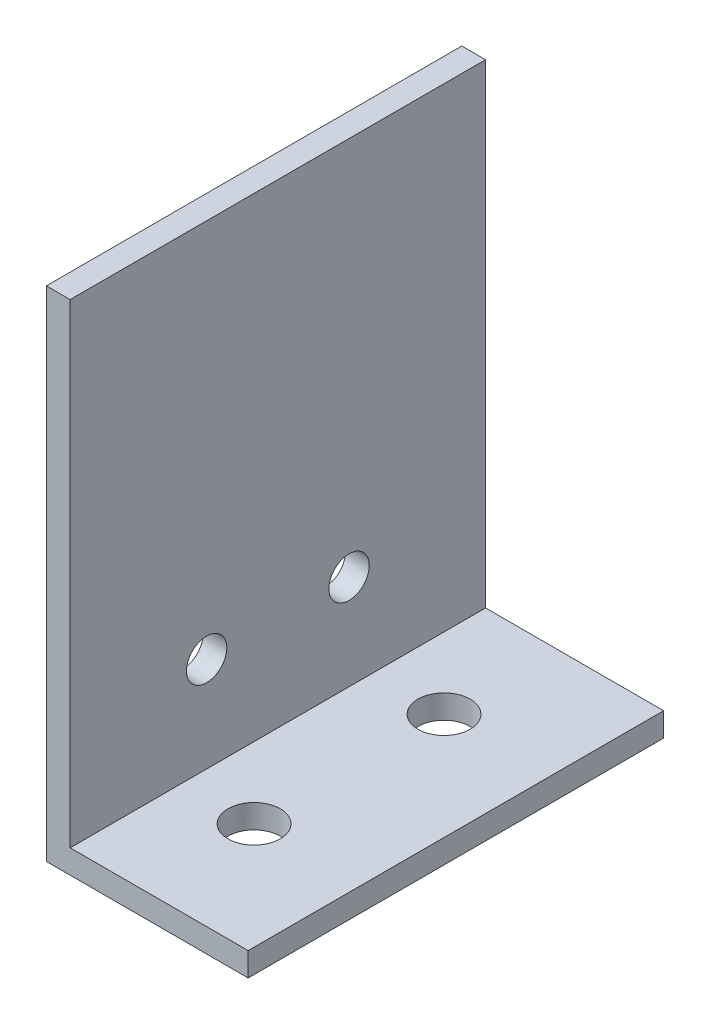
ISO-10303-21;
HEADER;
FILE_DESCRIPTION(('STEP AP214'),'2;1');
FILE_NAME('part.step','',(''),(''),'','','');
FILE_SCHEMA(('AUTOMOTIVE_DESIGN { 1 0 10303 214 1 1 1 1 }'));
ENDSEC;
DATA;
#1=APPLICATION_CONTEXT('core data for automotive mechanical design processes');
#2=APPLICATION_PROTOCOL_DEFINITION('international standard','automotive_design',2000,#1);
#3=PRODUCT_CONTEXT('',#1,'mechanical');
#4=PRODUCT('Part','Part','',(#3));
#5=PRODUCT_RELATED_PRODUCT_CATEGORY('part','',(#4));
#6=PRODUCT_DEFINITION_FORMATION('','',#4);
#7=PRODUCT_DEFINITION_CONTEXT('part definition',#1,'design');
#8=PRODUCT_DEFINITION('design','',#6,#7);
#9=PRODUCT_DEFINITION_SHAPE('','',#8);
#10=(LENGTH_UNIT() NAMED_UNIT(*) SI_UNIT(.MILLI.,.METRE.));
#11=(NAMED_UNIT(*) PLANE_ANGLE_UNIT() SI_UNIT($,.RADIAN.));
#12=(NAMED_UNIT(*) SI_UNIT($,.STERADIAN.) SOLID_ANGLE_UNIT());
#13=UNCERTAINTY_MEASURE_WITH_UNIT(LENGTH_MEASURE(1.E-05),#10,'distance_accuracy_value','');
#14=(GEOMETRIC_REPRESENTATION_CONTEXT(3) GLOBAL_UNCERTAINTY_ASSIGNED_CONTEXT((#13)) GLOBAL_UNIT_ASSIGNED_CONTEXT((#10,
#11,#12)) REPRESENTATION_CONTEXT('',''));
#15=CARTESIAN_POINT('',(0.,0.,0.));
#16=DIRECTION('',(0.,0.,1.));
#17=DIRECTION('',(1.,0.,0.));
#18=AXIS2_PLACEMENT_3D('',#15,#16,#17);
#19=CARTESIAN_POINT('',(17.,0.,35.));
#20=DIRECTION('',(0.,1.,0.));
#21=DIRECTION('',(-1.,0.,0.));
#22=AXIS2_PLACEMENT_3D('',#19,#20,#21);
#23=PLANE('',#22);
#24=CARTESIAN_POINT('',(8.00000000000001,0.,25.5));
#25=DIRECTION('',(0.,1.,0.));
#26=DIRECTION('',(-1.,0.,0.));
#27=AXIS2_PLACEMENT_3D('',#24,#25,#26);
#28=CIRCLE('',#27,2.2);
#29=CARTESIAN_POINT('',(5.80000000000001,0.,25.5));
#30=VERTEX_POINT('',#29);
#31=EDGE_CURVE('E165',#30,#30,#28,.F.);
#32=ORIENTED_EDGE('',*,*,#31,.F.);
#33=EDGE_LOOP('',(#32));
#34=FACE_BOUND('',#33,.T.);
#35=CARTESIAN_POINT('',(8.00000000000001,0.,9.5));
#36=DIRECTION('',(0.,1.,0.));
#37=DIRECTION('',(-1.,0.,0.));
#38=AXIS2_PLACEMENT_3D('',#35,#36,#37);
#39=CIRCLE('',#38,2.2);
#40=CARTESIAN_POINT('',(5.80000000000001,0.,9.5));
#41=VERTEX_POINT('',#40);
#42=EDGE_CURVE('E123',#41,#41,#39,.F.);
#43=ORIENTED_EDGE('',*,*,#42,.F.);
#44=EDGE_LOOP('',(#43));
#45=FACE_BOUND('',#44,.T.);
#46=DIRECTION('',(1.,0.,0.));
#47=VECTOR('',#46,1.);
#48=CARTESIAN_POINT('',(17.,0.,0.));
#49=LINE('',#48,#47);
#50=CARTESIAN_POINT('',(0.,0.,0.));
#51=VERTEX_POINT('',#50);
#52=CARTESIAN_POINT('',(17.,0.,0.));
#53=VERTEX_POINT('',#52);
#54=EDGE_CURVE('E119',#51,#53,#49,.T.);
#55=ORIENTED_EDGE('',*,*,#54,.T.);
#56=DIRECTION('',(0.,0.,-1.));
#57=VECTOR('',#56,1.);
#58=CARTESIAN_POINT('',(17.,0.,35.));
#59=LINE('',#58,#57);
#60=CARTESIAN_POINT('',(17.,0.,35.));
#61=VERTEX_POINT('',#60);
#62=EDGE_CURVE('E11',#61,#53,#59,.T.);
#63=ORIENTED_EDGE('',*,*,#62,.F.);
#64=DIRECTION('',(1.,0.,0.));
#65=VECTOR('',#64,1.);
#66=CARTESIAN_POINT('',(17.,0.,35.));
#67=LINE('',#66,#65);
#68=CARTESIAN_POINT('',(0.,0.,35.));
#69=VERTEX_POINT('',#68);
#70=EDGE_CURVE('E130',#69,#61,#67,.T.);
#71=ORIENTED_EDGE('',*,*,#70,.F.);
#72=DIRECTION('',(0.,0.,-1.));
#73=VECTOR('',#72,1.);
#74=CARTESIAN_POINT('',(0.,0.,35.));
#75=LINE('',#74,#73);
#76=EDGE_CURVE('E115',#69,#51,#75,.T.);
#77=ORIENTED_EDGE('',*,*,#76,.T.);
#78=EDGE_LOOP('',(#55,#63,#71,#77));
#79=FACE_BOUND('',#78,.T.);
#80=ADVANCED_FACE('F35',(#34,#45,#79),#23,.F.);
#81=CARTESIAN_POINT('',(17.,2.,35.));
#82=DIRECTION('',(-1.,0.,0.));
#83=DIRECTION('',(0.,0.,1.));
#84=AXIS2_PLACEMENT_3D('',#81,#82,#83);
#85=PLANE('',#84);
#86=DIRECTION('',(0.,1.,0.));
#87=VECTOR('',#86,1.);
#88=CARTESIAN_POINT('',(17.,2.,0.));
#89=LINE('',#88,#87);
#90=CARTESIAN_POINT('',(17.,2.,0.));
#91=VERTEX_POINT('',#90);
#92=EDGE_CURVE('E122',#53,#91,#89,.T.);
#93=ORIENTED_EDGE('',*,*,#92,.T.);
#94=DIRECTION('',(0.,0.,-1.));
#95=VECTOR('',#94,1.);
#96=CARTESIAN_POINT('',(17.,2.,35.));
#97=LINE('',#96,#95);
#98=CARTESIAN_POINT('',(17.,2.,35.));
#99=VERTEX_POINT('',#98);
#100=EDGE_CURVE('E43',#99,#91,#97,.T.);
#101=ORIENTED_EDGE('',*,*,#100,.F.);
#102=DIRECTION('',(0.,1.,0.));
#103=VECTOR('',#102,1.);
#104=CARTESIAN_POINT('',(17.,2.,35.));
#105=LINE('',#104,#103);
#106=EDGE_CURVE('E88',#61,#99,#105,.T.);
#107=ORIENTED_EDGE('',*,*,#106,.F.);
#108=ORIENTED_EDGE('',*,*,#62,.T.);
#109=EDGE_LOOP('',(#93,#101,#107,#108));
#110=FACE_BOUND('',#109,.T.);
#111=ADVANCED_FACE('F157',(#110),#85,.F.);
#112=CARTESIAN_POINT('',(2.,2.,35.));
#113=DIRECTION('',(0.,-1.,0.));
#114=DIRECTION('',(1.,0.,0.));
#115=AXIS2_PLACEMENT_3D('',#112,#113,#114);
#116=PLANE('',#115);
#117=CARTESIAN_POINT('',(8.00000000000001,2.,25.5));
#118=DIRECTION('',(0.,1.,0.));
#119=DIRECTION('',(1.,0.,0.));
#120=AXIS2_PLACEMENT_3D('',#117,#118,#119);
#121=CIRCLE('',#120,2.2);
#122=CARTESIAN_POINT('',(10.2,2.,25.5));
#123=VERTEX_POINT('',#122);
#124=EDGE_CURVE('E177',#123,#123,#121,.T.);
#125=ORIENTED_EDGE('',*,*,#124,.F.);
#126=EDGE_LOOP('',(#125));
#127=FACE_BOUND('',#126,.T.);
#128=CARTESIAN_POINT('',(8.00000000000001,2.,9.5));
#129=DIRECTION('',(0.,1.,0.));
#130=DIRECTION('',(-1.,0.,0.));
#131=AXIS2_PLACEMENT_3D('',#128,#129,#130);
#132=CIRCLE('',#131,2.2);
#133=CARTESIAN_POINT('',(5.80000000000001,2.,9.5));
#134=VERTEX_POINT('',#133);
#135=EDGE_CURVE('E169',#134,#134,#132,.T.);
#136=ORIENTED_EDGE('',*,*,#135,.F.);
#137=EDGE_LOOP('',(#136));
#138=FACE_BOUND('',#137,.T.);
#139=DIRECTION('',(-1.,0.,0.));
#140=VECTOR('',#139,1.);
#141=CARTESIAN_POINT('',(2.,2.,0.));
#142=LINE('',#141,#140);
#143=CARTESIAN_POINT('',(2.,2.,0.));
#144=VERTEX_POINT('',#143);
#145=EDGE_CURVE('E125',#91,#144,#142,.T.);
#146=ORIENTED_EDGE('',*,*,#145,.T.);
#147=DIRECTION('',(0.,0.,-1.));
#148=VECTOR('',#147,1.);
#149=CARTESIAN_POINT('',(2.,2.,35.));
#150=LINE('',#149,#148);
#151=CARTESIAN_POINT('',(2.,2.,35.));
#152=VERTEX_POINT('',#151);
#153=EDGE_CURVE('E110',#152,#144,#150,.T.);
#154=ORIENTED_EDGE('',*,*,#153,.F.);
#155=DIRECTION('',(-1.,0.,0.));
#156=VECTOR('',#155,1.);
#157=CARTESIAN_POINT('',(2.,2.,35.));
#158=LINE('',#157,#156);
#159=EDGE_CURVE('E101',#99,#152,#158,.T.);
#160=ORIENTED_EDGE('',*,*,#159,.F.);
#161=ORIENTED_EDGE('',*,*,#100,.T.);
#162=EDGE_LOOP('',(#146,#154,#160,#161));
#163=FACE_BOUND('',#162,.T.);
#164=ADVANCED_FACE('F136',(#127,#138,#163),#116,.F.);
#165=CARTESIAN_POINT('',(1.99999999999999,42.,35.));
#166=DIRECTION('',(-1.,0.,0.));
#167=DIRECTION('',(0.,-1.,0.));
#168=AXIS2_PLACEMENT_3D('',#165,#166,#167);
#169=PLANE('',#168);
#170=CARTESIAN_POINT('',(2.,10.,23.5));
#171=DIRECTION('',(-1.,0.,0.));
#172=DIRECTION('',(0.,-1.,0.));
#173=AXIS2_PLACEMENT_3D('',#170,#171,#172);
#174=CIRCLE('',#173,1.7);
#175=CARTESIAN_POINT('',(2.,8.30000000000001,23.5));
#176=VERTEX_POINT('',#175);
#177=EDGE_CURVE('E186',#176,#176,#174,.T.);
#178=ORIENTED_EDGE('',*,*,#177,.T.);
#179=EDGE_LOOP('',(#178));
#180=FACE_BOUND('',#179,.T.);
#181=CARTESIAN_POINT('',(2.,10.,11.5));
#182=DIRECTION('',(-1.,0.,0.));
#183=DIRECTION('',(0.,-1.,0.));
#184=AXIS2_PLACEMENT_3D('',#181,#182,#183);
#185=CIRCLE('',#184,1.7);
#186=CARTESIAN_POINT('',(2.,8.30000000000001,11.5));
#187=VERTEX_POINT('',#186);
#188=EDGE_CURVE('E180',#187,#187,#185,.T.);
#189=ORIENTED_EDGE('',*,*,#188,.T.);
#190=EDGE_LOOP('',(#189));
#191=FACE_BOUND('',#190,.T.);
#192=DIRECTION('',(0.,1.,0.));
#193=VECTOR('',#192,1.);
#194=CARTESIAN_POINT('',(1.99999999999999,42.,0.));
#195=LINE('',#194,#193);
#196=CARTESIAN_POINT('',(1.99999999999999,42.,0.));
#197=VERTEX_POINT('',#196);
#198=EDGE_CURVE('E109',#144,#197,#195,.T.);
#199=ORIENTED_EDGE('',*,*,#198,.T.);
#200=DIRECTION('',(0.,0.,-1.));
#201=VECTOR('',#200,1.);
#202=CARTESIAN_POINT('',(1.99999999999999,42.,35.));
#203=LINE('',#202,#201);
#204=CARTESIAN_POINT('',(1.99999999999999,42.,35.));
#205=VERTEX_POINT('',#204);
#206=EDGE_CURVE('E106',#205,#197,#203,.T.);
#207=ORIENTED_EDGE('',*,*,#206,.F.);
#208=DIRECTION('',(0.,1.,0.));
#209=VECTOR('',#208,1.);
#210=CARTESIAN_POINT('',(1.99999999999999,42.,35.));
#211=LINE('',#210,#209);
#212=EDGE_CURVE('E95',#152,#205,#211,.T.);
#213=ORIENTED_EDGE('',*,*,#212,.F.);
#214=ORIENTED_EDGE('',*,*,#153,.T.);
#215=EDGE_LOOP('',(#199,#207,#213,#214));
#216=FACE_BOUND('',#215,.T.);
#217=ADVANCED_FACE('F107',(#180,#191,#216),#169,.F.);
#218=CARTESIAN_POINT('',(0.,42.,35.));
#219=DIRECTION('',(0.,-1.,0.));
#220=DIRECTION('',(0.,0.,-1.));
#221=AXIS2_PLACEMENT_3D('',#218,#219,#220);
#222=PLANE('',#221);
#223=DIRECTION('',(-1.,0.,0.));
#224=VECTOR('',#223,1.);
#225=CARTESIAN_POINT('',(0.,42.,0.));
#226=LINE('',#225,#224);
#227=CARTESIAN_POINT('',(0.,42.,0.));
#228=VERTEX_POINT('',#227);
#229=EDGE_CURVE('E74',#197,#228,#226,.T.);
#230=ORIENTED_EDGE('',*,*,#229,.T.);
#231=DIRECTION('',(0.,0.,-1.));
#232=VECTOR('',#231,1.);
#233=CARTESIAN_POINT('',(0.,42.,35.));
#234=LINE('',#233,#232);
#235=CARTESIAN_POINT('',(0.,42.,35.));
#236=VERTEX_POINT('',#235);
#237=EDGE_CURVE('E111',#236,#228,#234,.T.);
#238=ORIENTED_EDGE('',*,*,#237,.F.);
#239=DIRECTION('',(-1.,0.,0.));
#240=VECTOR('',#239,1.);
#241=CARTESIAN_POINT('',(0.,42.,35.));
#242=LINE('',#241,#240);
#243=EDGE_CURVE('E99',#205,#236,#242,.T.);
#244=ORIENTED_EDGE('',*,*,#243,.F.);
#245=ORIENTED_EDGE('',*,*,#206,.T.);
#246=EDGE_LOOP('',(#230,#238,#244,#245));
#247=FACE_BOUND('',#246,.T.);
#248=ADVANCED_FACE('F113',(#247),#222,.F.);
#249=CARTESIAN_POINT('',(0.,0.,35.));
#250=DIRECTION('',(1.,0.,0.));
#251=DIRECTION('',(0.,1.,0.));
#252=AXIS2_PLACEMENT_3D('',#249,#250,#251);
#253=PLANE('',#252);
#254=CARTESIAN_POINT('',(0.,10.,23.5));
#255=DIRECTION('',(-1.,0.,0.));
#256=DIRECTION('',(0.,1.,0.));
#257=AXIS2_PLACEMENT_3D('',#254,#255,#256);
#258=CIRCLE('',#257,1.7);
#259=CARTESIAN_POINT('',(0.,11.7,23.5));
#260=VERTEX_POINT('',#259);
#261=EDGE_CURVE('E189',#260,#260,#258,.T.);
#262=ORIENTED_EDGE('',*,*,#261,.F.);
#263=EDGE_LOOP('',(#262));
#264=FACE_BOUND('',#263,.T.);
#265=CARTESIAN_POINT('',(0.,10.,11.5));
#266=DIRECTION('',(-1.,0.,0.));
#267=DIRECTION('',(0.,-1.,0.));
#268=AXIS2_PLACEMENT_3D('',#265,#266,#267);
#269=CIRCLE('',#268,1.7);
#270=CARTESIAN_POINT('',(0.,8.30000000000001,11.5));
#271=VERTEX_POINT('',#270);
#272=EDGE_CURVE('E183',#271,#271,#269,.T.);
#273=ORIENTED_EDGE('',*,*,#272,.F.);
#274=EDGE_LOOP('',(#273));
#275=FACE_BOUND('',#274,.T.);
#276=DIRECTION('',(0.,-1.,0.));
#277=VECTOR('',#276,1.);
#278=CARTESIAN_POINT('',(0.,0.,0.));
#279=LINE('',#278,#277);
#280=EDGE_CURVE('E80',#228,#51,#279,.T.);
#281=ORIENTED_EDGE('',*,*,#280,.T.);
#282=ORIENTED_EDGE('',*,*,#76,.F.);
#283=DIRECTION('',(0.,-1.,0.));
#284=VECTOR('',#283,1.);
#285=CARTESIAN_POINT('',(0.,0.,35.));
#286=LINE('',#285,#284);
#287=EDGE_CURVE('E51',#236,#69,#286,.T.);
#288=ORIENTED_EDGE('',*,*,#287,.F.);
#289=ORIENTED_EDGE('',*,*,#237,.T.);
#290=EDGE_LOOP('',(#281,#282,#288,#289));
#291=FACE_BOUND('',#290,.T.);
#292=ADVANCED_FACE('F143',(#264,#275,#291),#253,.F.);
#293=CARTESIAN_POINT('',(0.,0.,35.));
#294=DIRECTION('',(0.,0.,-1.));
#295=DIRECTION('',(-1.,0.,0.));
#296=AXIS2_PLACEMENT_3D('',#293,#294,#295);
#297=PLANE('',#296);
#298=ORIENTED_EDGE('',*,*,#70,.T.);
#299=ORIENTED_EDGE('',*,*,#106,.T.);
#300=ORIENTED_EDGE('',*,*,#159,.T.);
#301=ORIENTED_EDGE('',*,*,#212,.T.);
#302=ORIENTED_EDGE('',*,*,#243,.T.);
#303=ORIENTED_EDGE('',*,*,#287,.T.);
#304=EDGE_LOOP('',(#298,#299,#300,#301,#302,#303));
#305=FACE_BOUND('',#304,.T.);
#306=ADVANCED_FACE('F97',(#305),#297,.F.);
#307=CARTESIAN_POINT('',(0.,0.,0.));
#308=DIRECTION('',(0.,0.,-1.));
#309=DIRECTION('',(-1.,0.,0.));
#310=AXIS2_PLACEMENT_3D('',#307,#308,#309);
#311=PLANE('',#310);
#312=ORIENTED_EDGE('',*,*,#54,.F.);
#313=ORIENTED_EDGE('',*,*,#280,.F.);
#314=ORIENTED_EDGE('',*,*,#229,.F.);
#315=ORIENTED_EDGE('',*,*,#198,.F.);
#316=ORIENTED_EDGE('',*,*,#145,.F.);
#317=ORIENTED_EDGE('',*,*,#92,.F.);
#318=EDGE_LOOP('',(#312,#313,#314,#315,#316,#317));
#319=FACE_BOUND('',#318,.T.);
#320=ADVANCED_FACE('F139',(#319),#311,.T.);
#321=CARTESIAN_POINT('',(8.00000000000001,-0.00100000000000057,9.5));
#322=DIRECTION('',(0.,1.,0.));
#323=DIRECTION('',(-1.,0.,0.));
#324=AXIS2_PLACEMENT_3D('',#321,#322,#323);
#325=CYLINDRICAL_SURFACE('',#324,2.2);
#326=ORIENTED_EDGE('',*,*,#135,.T.);
#327=EDGE_LOOP('',(#326));
#328=FACE_BOUND('',#327,.T.);
#329=ORIENTED_EDGE('',*,*,#42,.T.);
#330=EDGE_LOOP('',(#329));
#331=FACE_BOUND('',#330,.T.);
#332=ADVANCED_FACE('F211',(#328,#331),#325,.F.);
#333=CARTESIAN_POINT('',(8.00000000000001,-0.00100000000000057,25.5));
#334=DIRECTION('',(0.,1.,0.));
#335=DIRECTION('',(-1.,0.,0.));
#336=AXIS2_PLACEMENT_3D('',#333,#334,#335);
#337=CYLINDRICAL_SURFACE('',#336,2.2);
#338=ORIENTED_EDGE('',*,*,#124,.T.);
#339=EDGE_LOOP('',(#338));
#340=FACE_BOUND('',#339,.T.);
#341=ORIENTED_EDGE('',*,*,#31,.T.);
#342=EDGE_LOOP('',(#341));
#343=FACE_BOUND('',#342,.T.);
#344=ADVANCED_FACE('F205',(#340,#343),#337,.F.);
#345=CARTESIAN_POINT('',(17.,10.,11.5));
#346=DIRECTION('',(-1.,0.,0.));
#347=DIRECTION('',(0.,-1.,0.));
#348=AXIS2_PLACEMENT_3D('',#345,#346,#347);
#349=CYLINDRICAL_SURFACE('',#348,1.7);
#350=ORIENTED_EDGE('',*,*,#272,.T.);
#351=EDGE_LOOP('',(#350));
#352=FACE_BOUND('',#351,.T.);
#353=ORIENTED_EDGE('',*,*,#188,.F.);
#354=EDGE_LOOP('',(#353));
#355=FACE_BOUND('',#354,.T.);
#356=ADVANCED_FACE('F195',(#352,#355),#349,.F.);
#357=CARTESIAN_POINT('',(17.,10.,23.5));
#358=DIRECTION('',(-1.,0.,0.));
#359=DIRECTION('',(0.,-1.,0.));
#360=AXIS2_PLACEMENT_3D('',#357,#358,#359);
#361=CYLINDRICAL_SURFACE('',#360,1.7);
#362=ORIENTED_EDGE('',*,*,#261,.T.);
#363=EDGE_LOOP('',(#362));
#364=FACE_BOUND('',#363,.T.);
#365=ORIENTED_EDGE('',*,*,#177,.F.);
#366=EDGE_LOOP('',(#365));
#367=FACE_BOUND('',#366,.T.);
#368=ADVANCED_FACE('F192',(#364,#367),#361,.F.);
#369=CLOSED_SHELL('',(#80,#111,#164,#217,#248,#292,#306,#320,#332,#344,#356,#368));
#370=MANIFOLD_SOLID_BREP('B2',#369);
#371=ADVANCED_BREP_SHAPE_REPRESENTATION('',(#18,#370),#14);
#372=SHAPE_DEFINITION_REPRESENTATION(#9,#371);
ENDSEC;
END-ISO-10303-21;
